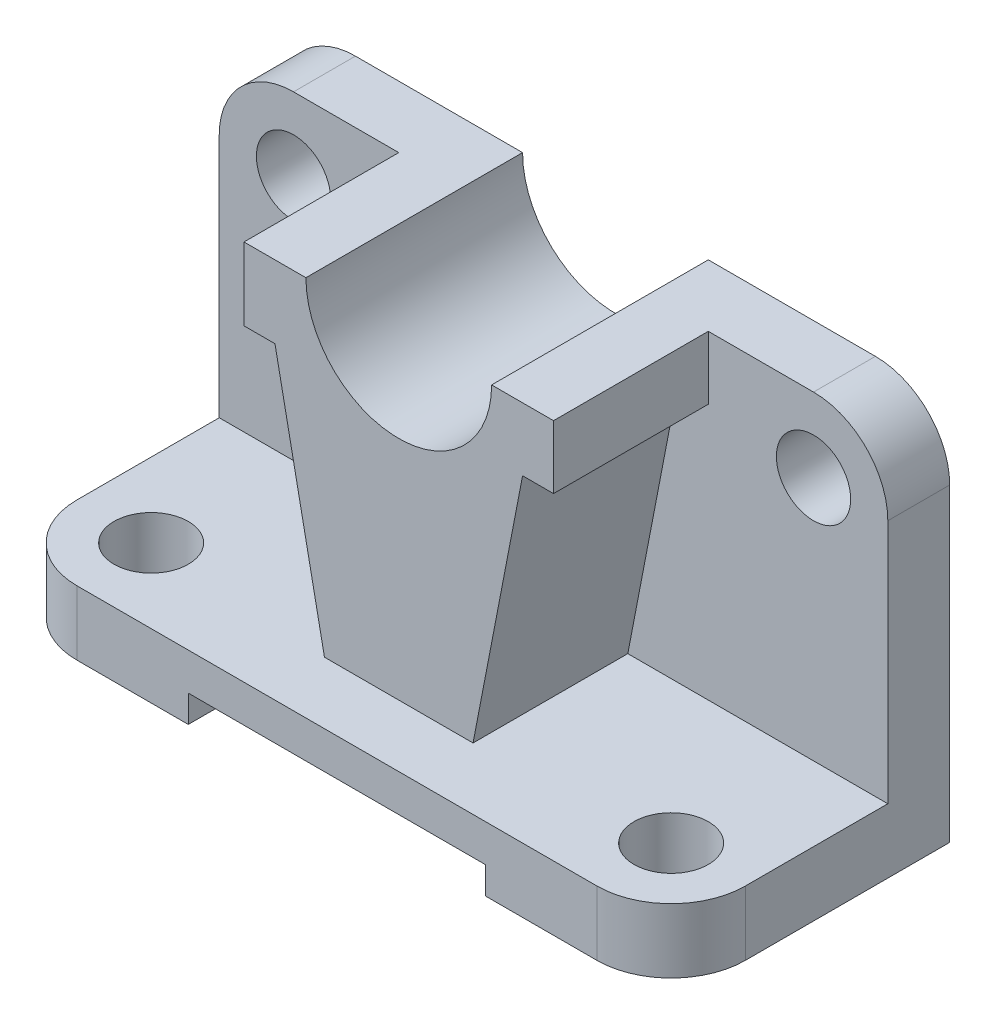
ISO-10303-21;
HEADER;
FILE_DESCRIPTION(('STEP AP214'),'2;1');
FILE_NAME('part.step','',(''),(''),'','','');
FILE_SCHEMA(('AUTOMOTIVE_DESIGN { 1 0 10303 214 1 1 1 1 }'));
ENDSEC;
DATA;
#1=APPLICATION_CONTEXT('core data for automotive mechanical design processes');
#2=APPLICATION_PROTOCOL_DEFINITION('international standard','automotive_design',2000,#1);
#3=PRODUCT_CONTEXT('',#1,'mechanical');
#4=PRODUCT('Part','Part','',(#3));
#5=PRODUCT_RELATED_PRODUCT_CATEGORY('part','',(#4));
#6=PRODUCT_DEFINITION_FORMATION('','',#4);
#7=PRODUCT_DEFINITION_CONTEXT('part definition',#1,'design');
#8=PRODUCT_DEFINITION('design','',#6,#7);
#9=PRODUCT_DEFINITION_SHAPE('','',#8);
#10=(LENGTH_UNIT() NAMED_UNIT(*) SI_UNIT(.MILLI.,.METRE.));
#11=(NAMED_UNIT(*) PLANE_ANGLE_UNIT() SI_UNIT($,.RADIAN.));
#12=(NAMED_UNIT(*) SI_UNIT($,.STERADIAN.) SOLID_ANGLE_UNIT());
#13=UNCERTAINTY_MEASURE_WITH_UNIT(LENGTH_MEASURE(1.E-05),#10,'distance_accuracy_value','');
#14=(GEOMETRIC_REPRESENTATION_CONTEXT(3) GLOBAL_UNCERTAINTY_ASSIGNED_CONTEXT((#13)) GLOBAL_UNIT_ASSIGNED_CONTEXT((#10,
#11,#12)) REPRESENTATION_CONTEXT('',''));
#15=CARTESIAN_POINT('',(0.,0.,0.));
#16=DIRECTION('',(0.,0.,1.));
#17=DIRECTION('',(1.,0.,0.));
#18=AXIS2_PLACEMENT_3D('',#15,#16,#17);
#19=CARTESIAN_POINT('',(0.,10.4081632653061,45.));
#20=DIRECTION('',(0.,1.,0.));
#21=DIRECTION('',(0.,0.,1.));
#22=AXIS2_PLACEMENT_3D('',#19,#20,#21);
#23=PLANE('',#22);
#24=CARTESIAN_POINT('',(12.,10.4081632653061,33.));
#25=DIRECTION('',(0.,1.,0.));
#26=DIRECTION('',(0.,0.,1.));
#27=AXIS2_PLACEMENT_3D('',#24,#25,#26);
#28=CIRCLE('',#27,6.);
#29=CARTESIAN_POINT('',(12.,10.4081632653061,39.));
#30=VERTEX_POINT('',#29);
#31=EDGE_CURVE('E397',#30,#30,#28,.T.);
#32=ORIENTED_EDGE('',*,*,#31,.F.);
#33=EDGE_LOOP('',(#32));
#34=FACE_BOUND('',#33,.T.);
#35=CARTESIAN_POINT('',(96.,10.4081632653061,33.));
#36=DIRECTION('',(0.,1.,0.));
#37=DIRECTION('',(0.,0.,1.));
#38=AXIS2_PLACEMENT_3D('',#35,#36,#37);
#39=CIRCLE('',#38,6.);
#40=CARTESIAN_POINT('',(96.,10.4081632653061,39.));
#41=VERTEX_POINT('',#40);
#42=EDGE_CURVE('E394',#41,#41,#39,.T.);
#43=ORIENTED_EDGE('',*,*,#42,.F.);
#44=EDGE_LOOP('',(#43));
#45=FACE_BOUND('',#44,.T.);
#46=DIRECTION('',(1.,0.,0.));
#47=VECTOR('',#46,1.);
#48=CARTESIAN_POINT('',(0.,10.4081632653061,45.));
#49=LINE('',#48,#47);
#50=CARTESIAN_POINT('',(12.,10.4081632653061,45.));
#51=VERTEX_POINT('',#50);
#52=CARTESIAN_POINT('',(96.,10.4081632653061,45.));
#53=VERTEX_POINT('',#52);
#54=EDGE_CURVE('E281',#51,#53,#49,.T.);
#55=ORIENTED_EDGE('',*,*,#54,.T.);
#56=CARTESIAN_POINT('',(96.,10.4081632653061,33.));
#57=DIRECTION('',(0.,1.,0.));
#58=DIRECTION('',(0.,0.,1.));
#59=AXIS2_PLACEMENT_3D('',#56,#57,#58);
#60=CIRCLE('',#59,12.);
#61=CARTESIAN_POINT('',(108.,10.4081632653061,33.));
#62=VERTEX_POINT('',#61);
#63=EDGE_CURVE('E347',#53,#62,#60,.T.);
#64=ORIENTED_EDGE('',*,*,#63,.T.);
#65=DIRECTION('',(0.,0.,-1.));
#66=VECTOR('',#65,1.);
#67=CARTESIAN_POINT('',(108.,10.4081632653061,45.));
#68=LINE('',#67,#66);
#69=CARTESIAN_POINT('',(108.,10.4081632653061,10.));
#70=VERTEX_POINT('',#69);
#71=EDGE_CURVE('E314',#62,#70,#68,.T.);
#72=ORIENTED_EDGE('',*,*,#71,.T.);
#73=DIRECTION('',(1.,0.,0.));
#74=VECTOR('',#73,1.);
#75=CARTESIAN_POINT('',(0.,10.4081632653061,10.));
#76=LINE('',#75,#74);
#77=CARTESIAN_POINT('',(66.,10.4081632653061,10.));
#78=VERTEX_POINT('',#77);
#79=EDGE_CURVE('E219',#78,#70,#76,.T.);
#80=ORIENTED_EDGE('',*,*,#79,.F.);
#81=DIRECTION('',(0.,0.,-1.));
#82=VECTOR('',#81,1.);
#83=CARTESIAN_POINT('',(66.,10.4081632653061,35.));
#84=LINE('',#83,#82);
#85=CARTESIAN_POINT('',(66.,10.4081632653061,35.));
#86=VERTEX_POINT('',#85);
#87=EDGE_CURVE('E210',#86,#78,#84,.T.);
#88=ORIENTED_EDGE('',*,*,#87,.F.);
#89=DIRECTION('',(1.,0.,0.));
#90=VECTOR('',#89,1.);
#91=CARTESIAN_POINT('',(0.,10.4081632653061,35.));
#92=LINE('',#91,#90);
#93=CARTESIAN_POINT('',(42.,10.4081632653061,35.));
#94=VERTEX_POINT('',#93);
#95=EDGE_CURVE('E194',#94,#86,#92,.T.);
#96=ORIENTED_EDGE('',*,*,#95,.F.);
#97=DIRECTION('',(0.,0.,-1.));
#98=VECTOR('',#97,1.);
#99=CARTESIAN_POINT('',(42.,10.4081632653061,35.));
#100=LINE('',#99,#98);
#101=CARTESIAN_POINT('',(42.,10.4081632653061,10.));
#102=VERTEX_POINT('',#101);
#103=EDGE_CURVE('E361',#94,#102,#100,.T.);
#104=ORIENTED_EDGE('',*,*,#103,.T.);
#105=DIRECTION('',(1.,0.,0.));
#106=VECTOR('',#105,1.);
#107=CARTESIAN_POINT('',(0.,10.4081632653061,10.));
#108=LINE('',#107,#106);
#109=CARTESIAN_POINT('',(0.,10.4081632653061,10.));
#110=VERTEX_POINT('',#109);
#111=EDGE_CURVE('E262',#110,#102,#108,.T.);
#112=ORIENTED_EDGE('',*,*,#111,.F.);
#113=DIRECTION('',(0.,0.,-1.));
#114=VECTOR('',#113,1.);
#115=CARTESIAN_POINT('',(0.,10.4081632653061,45.));
#116=LINE('',#115,#114);
#117=CARTESIAN_POINT('',(0.,10.4081632653061,33.));
#118=VERTEX_POINT('',#117);
#119=EDGE_CURVE('E312',#118,#110,#116,.T.);
#120=ORIENTED_EDGE('',*,*,#119,.F.);
#121=CARTESIAN_POINT('',(12.,10.4081632653061,33.));
#122=DIRECTION('',(0.,1.,0.));
#123=DIRECTION('',(0.,0.,1.));
#124=AXIS2_PLACEMENT_3D('',#121,#122,#123);
#125=CIRCLE('',#124,12.);
#126=EDGE_CURVE('E345',#118,#51,#125,.T.);
#127=ORIENTED_EDGE('',*,*,#126,.T.);
#128=EDGE_LOOP('',(#55,#64,#72,#80,#88,#96,#104,#112,#120,#127));
#129=FACE_BOUND('',#128,.T.);
#130=ADVANCED_FACE('F33',(#34,#45,#129),#23,.T.);
#131=CARTESIAN_POINT('',(0.,4.38775510204082,45.));
#132=DIRECTION('',(0.,1.,0.));
#133=DIRECTION('',(0.,0.,1.));
#134=AXIS2_PLACEMENT_3D('',#131,#132,#133);
#135=PLANE('',#134);
#136=DIRECTION('',(1.,0.,0.));
#137=VECTOR('',#136,1.);
#138=CARTESIAN_POINT('',(0.,4.38775510204082,0.));
#139=LINE('',#138,#137);
#140=CARTESIAN_POINT('',(30.0000000000001,4.38775510204082,0.));
#141=VERTEX_POINT('',#140);
#142=CARTESIAN_POINT('',(78.,4.38775510204082,0.));
#143=VERTEX_POINT('',#142);
#144=EDGE_CURVE('E268',#141,#143,#139,.T.);
#145=ORIENTED_EDGE('',*,*,#144,.T.);
#146=DIRECTION('',(0.,0.,-1.));
#147=VECTOR('',#146,1.);
#148=CARTESIAN_POINT('',(78.,4.38775510204082,45.));
#149=LINE('',#148,#147);
#150=CARTESIAN_POINT('',(78.,4.38775510204082,45.));
#151=VERTEX_POINT('',#150);
#152=EDGE_CURVE('E320',#151,#143,#149,.T.);
#153=ORIENTED_EDGE('',*,*,#152,.F.);
#154=DIRECTION('',(1.,0.,0.));
#155=VECTOR('',#154,1.);
#156=CARTESIAN_POINT('',(0.,4.38775510204082,45.));
#157=LINE('',#156,#155);
#158=CARTESIAN_POINT('',(30.0000000000001,4.38775510204082,45.));
#159=VERTEX_POINT('',#158);
#160=EDGE_CURVE('E272',#159,#151,#157,.T.);
#161=ORIENTED_EDGE('',*,*,#160,.F.);
#162=DIRECTION('',(0.,0.,-1.));
#163=VECTOR('',#162,1.);
#164=CARTESIAN_POINT('',(30.0000000000001,4.38775510204082,45.));
#165=LINE('',#164,#163);
#166=EDGE_CURVE('E287',#159,#141,#165,.T.);
#167=ORIENTED_EDGE('',*,*,#166,.T.);
#168=EDGE_LOOP('',(#145,#153,#161,#167));
#169=FACE_BOUND('',#168,.T.);
#170=ADVANCED_FACE('F449',(#169),#135,.F.);
#171=CARTESIAN_POINT('',(78.,0.,45.));
#172=DIRECTION('',(-1.,0.,0.));
#173=DIRECTION('',(0.,0.,1.));
#174=AXIS2_PLACEMENT_3D('',#171,#172,#173);
#175=PLANE('',#174);
#176=DIRECTION('',(0.,1.,0.));
#177=VECTOR('',#176,1.);
#178=CARTESIAN_POINT('',(78.,0.,0.));
#179=LINE('',#178,#177);
#180=CARTESIAN_POINT('',(78.,0.,0.));
#181=VERTEX_POINT('',#180);
#182=EDGE_CURVE('E290',#181,#143,#179,.T.);
#183=ORIENTED_EDGE('',*,*,#182,.F.);
#184=DIRECTION('',(0.,0.,-1.));
#185=VECTOR('',#184,1.);
#186=CARTESIAN_POINT('',(78.,0.,45.));
#187=LINE('',#186,#185);
#188=CARTESIAN_POINT('',(78.,0.,45.));
#189=VERTEX_POINT('',#188);
#190=EDGE_CURVE('E318',#189,#181,#187,.T.);
#191=ORIENTED_EDGE('',*,*,#190,.F.);
#192=DIRECTION('',(0.,1.,0.));
#193=VECTOR('',#192,1.);
#194=CARTESIAN_POINT('',(78.,0.,45.));
#195=LINE('',#194,#193);
#196=EDGE_CURVE('E274',#189,#151,#195,.T.);
#197=ORIENTED_EDGE('',*,*,#196,.T.);
#198=ORIENTED_EDGE('',*,*,#152,.T.);
#199=EDGE_LOOP('',(#183,#191,#197,#198));
#200=FACE_BOUND('',#199,.T.);
#201=ADVANCED_FACE('F444',(#200),#175,.T.);
#202=CARTESIAN_POINT('',(0.,0.,45.));
#203=DIRECTION('',(0.,1.,0.));
#204=DIRECTION('',(0.,0.,1.));
#205=AXIS2_PLACEMENT_3D('',#202,#203,#204);
#206=PLANE('',#205);
#207=CARTESIAN_POINT('',(96.,0.,33.));
#208=DIRECTION('',(0.,1.,0.));
#209=DIRECTION('',(0.,0.,1.));
#210=AXIS2_PLACEMENT_3D('',#207,#208,#209);
#211=CIRCLE('',#210,6.);
#212=CARTESIAN_POINT('',(96.,0.,39.));
#213=VERTEX_POINT('',#212);
#214=EDGE_CURVE('E551',#213,#213,#211,.T.);
#215=ORIENTED_EDGE('',*,*,#214,.T.);
#216=EDGE_LOOP('',(#215));
#217=FACE_BOUND('',#216,.T.);
#218=DIRECTION('',(0.,0.,-1.));
#219=VECTOR('',#218,1.);
#220=CARTESIAN_POINT('',(108.,0.,45.));
#221=LINE('',#220,#219);
#222=CARTESIAN_POINT('',(108.,0.,33.));
#223=VERTEX_POINT('',#222);
#224=CARTESIAN_POINT('',(108.,0.,0.));
#225=VERTEX_POINT('',#224);
#226=EDGE_CURVE('E316',#223,#225,#221,.T.);
#227=ORIENTED_EDGE('',*,*,#226,.F.);
#228=CARTESIAN_POINT('',(96.,0.,33.));
#229=DIRECTION('',(0.,1.,0.));
#230=DIRECTION('',(0.,0.,1.));
#231=AXIS2_PLACEMENT_3D('',#228,#229,#230);
#232=CIRCLE('',#231,12.);
#233=CARTESIAN_POINT('',(96.,0.,45.));
#234=VERTEX_POINT('',#233);
#235=EDGE_CURVE('E350',#223,#234,#232,.F.);
#236=ORIENTED_EDGE('',*,*,#235,.T.);
#237=DIRECTION('',(1.,0.,0.));
#238=VECTOR('',#237,1.);
#239=CARTESIAN_POINT('',(0.,0.,45.));
#240=LINE('',#239,#238);
#241=EDGE_CURVE('E278',#189,#234,#240,.T.);
#242=ORIENTED_EDGE('',*,*,#241,.F.);
#243=ORIENTED_EDGE('',*,*,#190,.T.);
#244=DIRECTION('',(1.,0.,0.));
#245=VECTOR('',#244,1.);
#246=CARTESIAN_POINT('',(0.,0.,0.));
#247=LINE('',#246,#245);
#248=EDGE_CURVE('E293',#181,#225,#247,.T.);
#249=ORIENTED_EDGE('',*,*,#248,.T.);
#250=EDGE_LOOP('',(#227,#236,#242,#243,#249));
#251=FACE_BOUND('',#250,.T.);
#252=ADVANCED_FACE('F439',(#217,#251),#206,.F.);
#253=CARTESIAN_POINT('',(108.,0.,45.));
#254=DIRECTION('',(-1.,0.,0.));
#255=DIRECTION('',(0.,0.,1.));
#256=AXIS2_PLACEMENT_3D('',#253,#254,#255);
#257=PLANE('',#256);
#258=ORIENTED_EDGE('',*,*,#71,.F.);
#259=DIRECTION('',(0.,1.,0.));
#260=VECTOR('',#259,1.);
#261=CARTESIAN_POINT('',(108.,0.,33.));
#262=LINE('',#261,#260);
#263=EDGE_CURVE('E54',#62,#223,#262,.F.);
#264=ORIENTED_EDGE('',*,*,#263,.T.);
#265=ORIENTED_EDGE('',*,*,#226,.T.);
#266=DIRECTION('',(0.,1.,0.));
#267=VECTOR('',#266,1.);
#268=CARTESIAN_POINT('',(108.,0.,0.));
#269=LINE('',#268,#267);
#270=CARTESIAN_POINT('',(108.,50.,0.));
#271=VERTEX_POINT('',#270);
#272=EDGE_CURVE('E296',#225,#271,#269,.T.);
#273=ORIENTED_EDGE('',*,*,#272,.T.);
#274=DIRECTION('',(0.,0.,-1.));
#275=VECTOR('',#274,1.);
#276=CARTESIAN_POINT('',(108.,50.,10.));
#277=LINE('',#276,#275);
#278=CARTESIAN_POINT('',(108.,50.,10.));
#279=VERTEX_POINT('',#278);
#280=EDGE_CURVE('E336',#271,#279,#277,.F.);
#281=ORIENTED_EDGE('',*,*,#280,.T.);
#282=DIRECTION('',(0.,1.,0.));
#283=VECTOR('',#282,1.);
#284=CARTESIAN_POINT('',(108.,0.,10.));
#285=LINE('',#284,#283);
#286=EDGE_CURVE('E238',#70,#279,#285,.T.);
#287=ORIENTED_EDGE('',*,*,#286,.F.);
#288=EDGE_LOOP('',(#258,#264,#265,#273,#281,#287));
#289=FACE_BOUND('',#288,.T.);
#290=ADVANCED_FACE('F435',(#289),#257,.F.);
#291=CARTESIAN_POINT('',(0.,0.,45.));
#292=DIRECTION('',(-1.,0.,0.));
#293=DIRECTION('',(0.,0.,1.));
#294=AXIS2_PLACEMENT_3D('',#291,#292,#293);
#295=PLANE('',#294);
#296=DIRECTION('',(0.,0.,-1.));
#297=VECTOR('',#296,1.);
#298=CARTESIAN_POINT('',(0.,0.,45.));
#299=LINE('',#298,#297);
#300=CARTESIAN_POINT('',(0.,0.,33.));
#301=VERTEX_POINT('',#300);
#302=CARTESIAN_POINT('',(0.,0.,0.));
#303=VERTEX_POINT('',#302);
#304=EDGE_CURVE('E310',#301,#303,#299,.T.);
#305=ORIENTED_EDGE('',*,*,#304,.F.);
#306=DIRECTION('',(0.,1.,0.));
#307=VECTOR('',#306,1.);
#308=CARTESIAN_POINT('',(0.,0.,33.));
#309=LINE('',#308,#307);
#310=EDGE_CURVE('E41',#301,#118,#309,.T.);
#311=ORIENTED_EDGE('',*,*,#310,.T.);
#312=ORIENTED_EDGE('',*,*,#119,.T.);
#313=DIRECTION('',(0.,1.,0.));
#314=VECTOR('',#313,1.);
#315=CARTESIAN_POINT('',(0.,0.,10.));
#316=LINE('',#315,#314);
#317=CARTESIAN_POINT('',(0.,50.,10.));
#318=VERTEX_POINT('',#317);
#319=EDGE_CURVE('E259',#110,#318,#316,.T.);
#320=ORIENTED_EDGE('',*,*,#319,.T.);
#321=DIRECTION('',(0.,0.,-1.));
#322=VECTOR('',#321,1.);
#323=CARTESIAN_POINT('',(0.,50.,45.));
#324=LINE('',#323,#322);
#325=CARTESIAN_POINT('',(0.,50.,0.));
#326=VERTEX_POINT('',#325);
#327=EDGE_CURVE('E322',#318,#326,#324,.T.);
#328=ORIENTED_EDGE('',*,*,#327,.T.);
#329=DIRECTION('',(0.,1.,0.));
#330=VECTOR('',#329,1.);
#331=CARTESIAN_POINT('',(0.,0.,0.));
#332=LINE('',#331,#330);
#333=EDGE_CURVE('E299',#303,#326,#332,.T.);
#334=ORIENTED_EDGE('',*,*,#333,.F.);
#335=EDGE_LOOP('',(#305,#311,#312,#320,#328,#334));
#336=FACE_BOUND('',#335,.T.);
#337=ADVANCED_FACE('F355',(#336),#295,.T.);
#338=CARTESIAN_POINT('',(0.,0.,45.));
#339=DIRECTION('',(0.,1.,0.));
#340=DIRECTION('',(0.,0.,1.));
#341=AXIS2_PLACEMENT_3D('',#338,#339,#340);
#342=PLANE('',#341);
#343=CARTESIAN_POINT('',(12.,0.,33.));
#344=DIRECTION('',(0.,1.,0.));
#345=DIRECTION('',(0.,0.,1.));
#346=AXIS2_PLACEMENT_3D('',#343,#344,#345);
#347=CIRCLE('',#346,6.);
#348=CARTESIAN_POINT('',(12.,0.,39.));
#349=VERTEX_POINT('',#348);
#350=EDGE_CURVE('E549',#349,#349,#347,.T.);
#351=ORIENTED_EDGE('',*,*,#350,.T.);
#352=EDGE_LOOP('',(#351));
#353=FACE_BOUND('',#352,.T.);
#354=DIRECTION('',(1.,0.,0.));
#355=VECTOR('',#354,1.);
#356=CARTESIAN_POINT('',(0.,0.,45.));
#357=LINE('',#356,#355);
#358=CARTESIAN_POINT('',(12.,0.,45.));
#359=VERTEX_POINT('',#358);
#360=CARTESIAN_POINT('',(30.0000000000001,0.,45.));
#361=VERTEX_POINT('',#360);
#362=EDGE_CURVE('E283',#359,#361,#357,.T.);
#363=ORIENTED_EDGE('',*,*,#362,.F.);
#364=CARTESIAN_POINT('',(12.,0.,33.));
#365=DIRECTION('',(0.,1.,0.));
#366=DIRECTION('',(0.,0.,1.));
#367=AXIS2_PLACEMENT_3D('',#364,#365,#366);
#368=CIRCLE('',#367,12.);
#369=EDGE_CURVE('E11',#359,#301,#368,.F.);
#370=ORIENTED_EDGE('',*,*,#369,.T.);
#371=ORIENTED_EDGE('',*,*,#304,.T.);
#372=DIRECTION('',(1.,0.,0.));
#373=VECTOR('',#372,1.);
#374=CARTESIAN_POINT('',(0.,0.,0.));
#375=LINE('',#374,#373);
#376=CARTESIAN_POINT('',(30.0000000000001,0.,0.));
#377=VERTEX_POINT('',#376);
#378=EDGE_CURVE('E302',#303,#377,#375,.T.);
#379=ORIENTED_EDGE('',*,*,#378,.T.);
#380=DIRECTION('',(0.,0.,-1.));
#381=VECTOR('',#380,1.);
#382=CARTESIAN_POINT('',(30.0000000000001,0.,45.));
#383=LINE('',#382,#381);
#384=EDGE_CURVE('E307',#361,#377,#383,.T.);
#385=ORIENTED_EDGE('',*,*,#384,.F.);
#386=EDGE_LOOP('',(#363,#370,#371,#379,#385));
#387=FACE_BOUND('',#386,.T.);
#388=ADVANCED_FACE('F456',(#353,#387),#342,.F.);
#389=CARTESIAN_POINT('',(30.0000000000001,0.,45.));
#390=DIRECTION('',(-1.,0.,0.));
#391=DIRECTION('',(0.,0.,1.));
#392=AXIS2_PLACEMENT_3D('',#389,#390,#391);
#393=PLANE('',#392);
#394=DIRECTION('',(0.,1.,0.));
#395=VECTOR('',#394,1.);
#396=CARTESIAN_POINT('',(30.0000000000001,0.,0.));
#397=LINE('',#396,#395);
#398=EDGE_CURVE('E275',#377,#141,#397,.T.);
#399=ORIENTED_EDGE('',*,*,#398,.T.);
#400=ORIENTED_EDGE('',*,*,#166,.F.);
#401=DIRECTION('',(0.,1.,0.));
#402=VECTOR('',#401,1.);
#403=CARTESIAN_POINT('',(30.0000000000001,0.,45.));
#404=LINE('',#403,#402);
#405=EDGE_CURVE('E285',#361,#159,#404,.T.);
#406=ORIENTED_EDGE('',*,*,#405,.F.);
#407=ORIENTED_EDGE('',*,*,#384,.T.);
#408=EDGE_LOOP('',(#399,#400,#406,#407));
#409=FACE_BOUND('',#408,.T.);
#410=ADVANCED_FACE('F453',(#409),#393,.F.);
#411=CARTESIAN_POINT('',(0.,0.,45.));
#412=DIRECTION('',(0.,0.,1.));
#413=DIRECTION('',(1.,0.,0.));
#414=AXIS2_PLACEMENT_3D('',#411,#412,#413);
#415=PLANE('',#414);
#416=ORIENTED_EDGE('',*,*,#241,.T.);
#417=DIRECTION('',(0.,1.,0.));
#418=VECTOR('',#417,1.);
#419=CARTESIAN_POINT('',(96.,10.4081632653061,45.));
#420=LINE('',#419,#418);
#421=EDGE_CURVE('E342',#234,#53,#420,.T.);
#422=ORIENTED_EDGE('',*,*,#421,.T.);
#423=ORIENTED_EDGE('',*,*,#54,.F.);
#424=DIRECTION('',(0.,1.,0.));
#425=VECTOR('',#424,1.);
#426=CARTESIAN_POINT('',(12.,0.,45.));
#427=LINE('',#426,#425);
#428=EDGE_CURVE('E340',#51,#359,#427,.F.);
#429=ORIENTED_EDGE('',*,*,#428,.T.);
#430=ORIENTED_EDGE('',*,*,#362,.T.);
#431=ORIENTED_EDGE('',*,*,#405,.T.);
#432=ORIENTED_EDGE('',*,*,#160,.T.);
#433=ORIENTED_EDGE('',*,*,#196,.F.);
#434=EDGE_LOOP('',(#416,#422,#423,#429,#430,#431,#432,#433));
#435=FACE_BOUND('',#434,.T.);
#436=ADVANCED_FACE('F459',(#435),#415,.T.);
#437=CARTESIAN_POINT('',(0.,0.,0.));
#438=DIRECTION('',(0.,0.,1.));
#439=DIRECTION('',(1.,0.,0.));
#440=AXIS2_PLACEMENT_3D('',#437,#438,#439);
#441=PLANE('',#440);
#442=DIRECTION('',(1.,0.,0.));
#443=VECTOR('',#442,1.);
#444=CARTESIAN_POINT('',(0.,62.,0.));
#445=LINE('',#444,#443);
#446=CARTESIAN_POINT('',(69.,62.,0.));
#447=VERTEX_POINT('',#446);
#448=CARTESIAN_POINT('',(96.,62.,0.));
#449=VERTEX_POINT('',#448);
#450=EDGE_CURVE('E223',#447,#449,#445,.T.);
#451=ORIENTED_EDGE('',*,*,#450,.T.);
#452=CARTESIAN_POINT('',(96.,50.,0.));
#453=DIRECTION('',(0.,0.,1.));
#454=DIRECTION('',(1.,0.,0.));
#455=AXIS2_PLACEMENT_3D('',#452,#453,#454);
#456=CIRCLE('',#455,12.);
#457=EDGE_CURVE('E334',#449,#271,#456,.F.);
#458=ORIENTED_EDGE('',*,*,#457,.T.);
#459=ORIENTED_EDGE('',*,*,#272,.F.);
#460=ORIENTED_EDGE('',*,*,#248,.F.);
#461=ORIENTED_EDGE('',*,*,#182,.T.);
#462=ORIENTED_EDGE('',*,*,#144,.F.);
#463=ORIENTED_EDGE('',*,*,#398,.F.);
#464=ORIENTED_EDGE('',*,*,#378,.F.);
#465=ORIENTED_EDGE('',*,*,#333,.T.);
#466=CARTESIAN_POINT('',(12.,50.,0.));
#467=DIRECTION('',(0.,0.,1.));
#468=DIRECTION('',(1.,0.,0.));
#469=AXIS2_PLACEMENT_3D('',#466,#467,#468);
#470=CIRCLE('',#469,12.);
#471=CARTESIAN_POINT('',(12.,62.,0.));
#472=VERTEX_POINT('',#471);
#473=EDGE_CURVE('E325',#326,#472,#470,.F.);
#474=ORIENTED_EDGE('',*,*,#473,.T.);
#475=DIRECTION('',(1.,0.,0.));
#476=VECTOR('',#475,1.);
#477=CARTESIAN_POINT('',(0.,62.,0.));
#478=LINE('',#477,#476);
#479=CARTESIAN_POINT('',(39.,62.,0.));
#480=VERTEX_POINT('',#479);
#481=EDGE_CURVE('E246',#472,#480,#478,.T.);
#482=ORIENTED_EDGE('',*,*,#481,.T.);
#483=CARTESIAN_POINT('',(54.,62.,0.));
#484=DIRECTION('',(0.,0.,1.));
#485=DIRECTION('',(1.,0.,0.));
#486=AXIS2_PLACEMENT_3D('',#483,#484,#485);
#487=CIRCLE('',#486,15.);
#488=EDGE_CURVE('E206',#447,#480,#487,.F.);
#489=ORIENTED_EDGE('',*,*,#488,.F.);
#490=EDGE_LOOP('',(#451,#458,#459,#460,#461,#462,#463,#464,#465,#474,#482,#489));
#491=FACE_BOUND('',#490,.T.);
#492=CARTESIAN_POINT('',(12.,50.,0.));
#493=DIRECTION('',(0.,0.,1.));
#494=DIRECTION('',(1.,0.,0.));
#495=AXIS2_PLACEMENT_3D('',#492,#493,#494);
#496=CIRCLE('',#495,6.);
#497=CARTESIAN_POINT('',(18.,50.,0.));
#498=VERTEX_POINT('',#497);
#499=EDGE_CURVE('E253',#498,#498,#496,.F.);
#500=ORIENTED_EDGE('',*,*,#499,.F.);
#501=EDGE_LOOP('',(#500));
#502=FACE_BOUND('',#501,.T.);
#503=CARTESIAN_POINT('',(96.,50.,0.));
#504=DIRECTION('',(0.,0.,1.));
#505=DIRECTION('',(1.,0.,0.));
#506=AXIS2_PLACEMENT_3D('',#503,#504,#505);
#507=CIRCLE('',#506,6.);
#508=CARTESIAN_POINT('',(102.,50.,0.));
#509=VERTEX_POINT('',#508);
#510=EDGE_CURVE('E220',#509,#509,#507,.T.);
#511=ORIENTED_EDGE('',*,*,#510,.T.);
#512=EDGE_LOOP('',(#511));
#513=FACE_BOUND('',#512,.T.);
#514=ADVANCED_FACE('F374',(#491,#502,#513),#441,.F.);
#515=CARTESIAN_POINT('',(0.,62.,10.));
#516=DIRECTION('',(0.,1.,0.));
#517=DIRECTION('',(0.,0.,1.));
#518=AXIS2_PLACEMENT_3D('',#515,#516,#517);
#519=PLANE('',#518);
#520=ORIENTED_EDGE('',*,*,#481,.F.);
#521=DIRECTION('',(0.,0.,-1.));
#522=VECTOR('',#521,1.);
#523=CARTESIAN_POINT('',(12.,62.,10.));
#524=LINE('',#523,#522);
#525=CARTESIAN_POINT('',(12.,62.,10.));
#526=VERTEX_POINT('',#525);
#527=EDGE_CURVE('E327',#472,#526,#524,.F.);
#528=ORIENTED_EDGE('',*,*,#527,.T.);
#529=DIRECTION('',(1.,0.,0.));
#530=VECTOR('',#529,1.);
#531=CARTESIAN_POINT('',(0.,62.,10.));
#532=LINE('',#531,#530);
#533=CARTESIAN_POINT('',(29.,62.,10.));
#534=VERTEX_POINT('',#533);
#535=EDGE_CURVE('E257',#526,#534,#532,.T.);
#536=ORIENTED_EDGE('',*,*,#535,.T.);
#537=DIRECTION('',(0.,0.,-1.));
#538=VECTOR('',#537,1.);
#539=CARTESIAN_POINT('',(29.,62.,35.));
#540=LINE('',#539,#538);
#541=CARTESIAN_POINT('',(29.,62.,35.));
#542=VERTEX_POINT('',#541);
#543=EDGE_CURVE('E390',#542,#534,#540,.T.);
#544=ORIENTED_EDGE('',*,*,#543,.F.);
#545=DIRECTION('',(1.,0.,0.));
#546=VECTOR('',#545,1.);
#547=CARTESIAN_POINT('',(0.,62.,35.));
#548=LINE('',#547,#546);
#549=CARTESIAN_POINT('',(39.,62.,35.));
#550=VERTEX_POINT('',#549);
#551=EDGE_CURVE('E386',#542,#550,#548,.T.);
#552=ORIENTED_EDGE('',*,*,#551,.T.);
#553=DIRECTION('',(0.,0.,-1.));
#554=VECTOR('',#553,1.);
#555=CARTESIAN_POINT('',(39.,62.,35.));
#556=LINE('',#555,#554);
#557=EDGE_CURVE('E383',#550,#480,#556,.T.);
#558=ORIENTED_EDGE('',*,*,#557,.T.);
#559=EDGE_LOOP('',(#520,#528,#536,#544,#552,#558));
#560=FACE_BOUND('',#559,.T.);
#561=ADVANCED_FACE('F380',(#560),#519,.T.);
#562=CARTESIAN_POINT('',(12.,50.,10.));
#563=DIRECTION('',(0.,0.,-1.));
#564=DIRECTION('',(-1.,0.,0.));
#565=AXIS2_PLACEMENT_3D('',#562,#563,#564);
#566=CYLINDRICAL_SURFACE('',#565,6.);
#567=CARTESIAN_POINT('',(12.,50.,10.));
#568=DIRECTION('',(0.,0.,1.));
#569=DIRECTION('',(1.,0.,0.));
#570=AXIS2_PLACEMENT_3D('',#567,#568,#569);
#571=CIRCLE('',#570,6.);
#572=CARTESIAN_POINT('',(18.,50.,10.));
#573=VERTEX_POINT('',#572);
#574=EDGE_CURVE('E265',#573,#573,#571,.F.);
#575=ORIENTED_EDGE('',*,*,#574,.F.);
#576=EDGE_LOOP('',(#575));
#577=FACE_BOUND('',#576,.T.);
#578=ORIENTED_EDGE('',*,*,#499,.T.);
#579=EDGE_LOOP('',(#578));
#580=FACE_BOUND('',#579,.T.);
#581=ADVANCED_FACE('F531',(#577,#580),#566,.F.);
#582=CARTESIAN_POINT('',(0.,0.,10.));
#583=DIRECTION('',(0.,0.,1.));
#584=DIRECTION('',(1.,0.,0.));
#585=AXIS2_PLACEMENT_3D('',#582,#583,#584);
#586=PLANE('',#585);
#587=ORIENTED_EDGE('',*,*,#535,.F.);
#588=CARTESIAN_POINT('',(12.,50.,10.));
#589=DIRECTION('',(0.,0.,1.));
#590=DIRECTION('',(1.,0.,0.));
#591=AXIS2_PLACEMENT_3D('',#588,#589,#590);
#592=CIRCLE('',#591,12.);
#593=EDGE_CURVE('E329',#526,#318,#592,.T.);
#594=ORIENTED_EDGE('',*,*,#593,.T.);
#595=ORIENTED_EDGE('',*,*,#319,.F.);
#596=ORIENTED_EDGE('',*,*,#111,.T.);
#597=DIRECTION('',(0.196791884871607,-0.980445283556752,0.));
#598=VECTOR('',#597,1.);
#599=CARTESIAN_POINT('',(42.3816533442477,8.50671178235797,10.));
#600=LINE('',#599,#598);
#601=CARTESIAN_POINT('',(34.,50.2653061224489,10.));
#602=VERTEX_POINT('',#601);
#603=EDGE_CURVE('E250',#602,#102,#600,.T.);
#604=ORIENTED_EDGE('',*,*,#603,.F.);
#605=DIRECTION('',(1.,0.,0.));
#606=VECTOR('',#605,1.);
#607=CARTESIAN_POINT('',(0.,50.265306122449,10.));
#608=LINE('',#607,#606);
#609=CARTESIAN_POINT('',(29.,50.265306122449,10.));
#610=VERTEX_POINT('',#609);
#611=EDGE_CURVE('E252',#610,#602,#608,.T.);
#612=ORIENTED_EDGE('',*,*,#611,.F.);
#613=DIRECTION('',(0.,-1.,0.));
#614=VECTOR('',#613,1.);
#615=CARTESIAN_POINT('',(29.,0.,10.));
#616=LINE('',#615,#614);
#617=EDGE_CURVE('E255',#534,#610,#616,.T.);
#618=ORIENTED_EDGE('',*,*,#617,.F.);
#619=EDGE_LOOP('',(#587,#594,#595,#596,#604,#612,#618));
#620=FACE_BOUND('',#619,.T.);
#621=ORIENTED_EDGE('',*,*,#574,.T.);
#622=EDGE_LOOP('',(#621));
#623=FACE_BOUND('',#622,.T.);
#624=ADVANCED_FACE('F365',(#620,#623),#586,.T.);
#625=CARTESIAN_POINT('',(0.,62.,10.));
#626=DIRECTION('',(0.,1.,0.));
#627=DIRECTION('',(0.,0.,1.));
#628=AXIS2_PLACEMENT_3D('',#625,#626,#627);
#629=PLANE('',#628);
#630=DIRECTION('',(1.,0.,0.));
#631=VECTOR('',#630,1.);
#632=CARTESIAN_POINT('',(0.,62.,10.));
#633=LINE('',#632,#631);
#634=CARTESIAN_POINT('',(79.,62.,10.));
#635=VERTEX_POINT('',#634);
#636=CARTESIAN_POINT('',(96.,62.,10.));
#637=VERTEX_POINT('',#636);
#638=EDGE_CURVE('E241',#635,#637,#633,.T.);
#639=ORIENTED_EDGE('',*,*,#638,.T.);
#640=DIRECTION('',(0.,0.,-1.));
#641=VECTOR('',#640,1.);
#642=CARTESIAN_POINT('',(96.,62.,0.));
#643=LINE('',#642,#641);
#644=EDGE_CURVE('E331',#637,#449,#643,.T.);
#645=ORIENTED_EDGE('',*,*,#644,.T.);
#646=ORIENTED_EDGE('',*,*,#450,.F.);
#647=DIRECTION('',(0.,0.,-1.));
#648=VECTOR('',#647,1.);
#649=CARTESIAN_POINT('',(69.,62.,35.));
#650=LINE('',#649,#648);
#651=CARTESIAN_POINT('',(69.,62.,35.));
#652=VERTEX_POINT('',#651);
#653=EDGE_CURVE('E389',#652,#447,#650,.T.);
#654=ORIENTED_EDGE('',*,*,#653,.F.);
#655=DIRECTION('',(1.,0.,0.));
#656=VECTOR('',#655,1.);
#657=CARTESIAN_POINT('',(0.,62.,35.));
#658=LINE('',#657,#656);
#659=CARTESIAN_POINT('',(79.,62.,35.));
#660=VERTEX_POINT('',#659);
#661=EDGE_CURVE('E560',#652,#660,#658,.T.);
#662=ORIENTED_EDGE('',*,*,#661,.T.);
#663=DIRECTION('',(0.,0.,-1.));
#664=VECTOR('',#663,1.);
#665=CARTESIAN_POINT('',(79.,62.,35.));
#666=LINE('',#665,#664);
#667=EDGE_CURVE('E412',#660,#635,#666,.T.);
#668=ORIENTED_EDGE('',*,*,#667,.T.);
#669=EDGE_LOOP('',(#639,#645,#646,#654,#662,#668));
#670=FACE_BOUND('',#669,.T.);
#671=ADVANCED_FACE('F428',(#670),#629,.T.);
#672=CARTESIAN_POINT('',(96.,50.,10.));
#673=DIRECTION('',(0.,0.,-1.));
#674=DIRECTION('',(-1.,0.,0.));
#675=AXIS2_PLACEMENT_3D('',#672,#673,#674);
#676=CYLINDRICAL_SURFACE('',#675,6.);
#677=CARTESIAN_POINT('',(96.,50.,10.));
#678=DIRECTION('',(0.,0.,1.));
#679=DIRECTION('',(1.,0.,0.));
#680=AXIS2_PLACEMENT_3D('',#677,#678,#679);
#681=CIRCLE('',#680,6.);
#682=CARTESIAN_POINT('',(102.,50.,10.));
#683=VERTEX_POINT('',#682);
#684=EDGE_CURVE('E229',#683,#683,#681,.T.);
#685=ORIENTED_EDGE('',*,*,#684,.T.);
#686=EDGE_LOOP('',(#685));
#687=FACE_BOUND('',#686,.T.);
#688=ORIENTED_EDGE('',*,*,#510,.F.);
#689=EDGE_LOOP('',(#688));
#690=FACE_BOUND('',#689,.T.);
#691=ADVANCED_FACE('F522',(#687,#690),#676,.F.);
#692=CARTESIAN_POINT('',(0.,0.,10.));
#693=DIRECTION('',(0.,0.,1.));
#694=DIRECTION('',(1.,0.,0.));
#695=AXIS2_PLACEMENT_3D('',#692,#693,#694);
#696=PLANE('',#695);
#697=ORIENTED_EDGE('',*,*,#684,.F.);
#698=EDGE_LOOP('',(#697));
#699=FACE_BOUND('',#698,.T.);
#700=ORIENTED_EDGE('',*,*,#286,.T.);
#701=CARTESIAN_POINT('',(96.,50.,10.));
#702=DIRECTION('',(0.,0.,1.));
#703=DIRECTION('',(1.,0.,0.));
#704=AXIS2_PLACEMENT_3D('',#701,#702,#703);
#705=CIRCLE('',#704,12.);
#706=EDGE_CURVE('E338',#279,#637,#705,.T.);
#707=ORIENTED_EDGE('',*,*,#706,.T.);
#708=ORIENTED_EDGE('',*,*,#638,.F.);
#709=DIRECTION('',(0.,-1.,0.));
#710=VECTOR('',#709,1.);
#711=CARTESIAN_POINT('',(79.0000000000001,1.07441833208099E-13,10.));
#712=LINE('',#711,#710);
#713=CARTESIAN_POINT('',(79.,51.7959183673469,10.));
#714=VERTEX_POINT('',#713);
#715=EDGE_CURVE('E244',#635,#714,#712,.T.);
#716=ORIENTED_EDGE('',*,*,#715,.T.);
#717=DIRECTION('',(-1.,0.,0.));
#718=VECTOR('',#717,1.);
#719=CARTESIAN_POINT('',(0.,51.795918367347,10.));
#720=LINE('',#719,#718);
#721=CARTESIAN_POINT('',(74.,51.7959183673469,10.));
#722=VERTEX_POINT('',#721);
#723=EDGE_CURVE('E232',#714,#722,#720,.T.);
#724=ORIENTED_EDGE('',*,*,#723,.T.);
#725=DIRECTION('',(-0.189781047165808,-0.981826437888413,0.));
#726=VECTOR('',#725,1.);
#727=CARTESIAN_POINT('',(61.6835137800812,-11.9230460561104,10.));
#728=LINE('',#727,#726);
#729=EDGE_CURVE('E235',#722,#78,#728,.T.);
#730=ORIENTED_EDGE('',*,*,#729,.T.);
#731=ORIENTED_EDGE('',*,*,#79,.T.);
#732=EDGE_LOOP('',(#700,#707,#708,#716,#724,#730,#731));
#733=FACE_BOUND('',#732,.T.);
#734=ADVANCED_FACE('F424',(#699,#733),#696,.T.);
#735=CARTESIAN_POINT('',(61.6835137800812,-11.9230460561104,35.));
#736=DIRECTION('',(0.981826437888413,-0.189781047165808,0.));
#737=DIRECTION('',(0.189781047165808,0.981826437888413,0.));
#738=AXIS2_PLACEMENT_3D('',#735,#736,#737);
#739=PLANE('',#738);
#740=ORIENTED_EDGE('',*,*,#87,.T.);
#741=ORIENTED_EDGE('',*,*,#729,.F.);
#742=DIRECTION('',(0.,0.,-1.));
#743=VECTOR('',#742,1.);
#744=CARTESIAN_POINT('',(74.,51.7959183673469,35.));
#745=LINE('',#744,#743);
#746=CARTESIAN_POINT('',(74.,51.7959183673469,35.));
#747=VERTEX_POINT('',#746);
#748=EDGE_CURVE('E213',#747,#722,#745,.T.);
#749=ORIENTED_EDGE('',*,*,#748,.F.);
#750=DIRECTION('',(-0.189781047165808,-0.981826437888413,0.));
#751=VECTOR('',#750,1.);
#752=CARTESIAN_POINT('',(61.6835137800812,-11.9230460561104,35.));
#753=LINE('',#752,#751);
#754=EDGE_CURVE('E198',#747,#86,#753,.T.);
#755=ORIENTED_EDGE('',*,*,#754,.T.);
#756=EDGE_LOOP('',(#740,#741,#749,#755));
#757=FACE_BOUND('',#756,.T.);
#758=ADVANCED_FACE('F209',(#757),#739,.T.);
#759=CARTESIAN_POINT('',(0.,51.795918367347,35.));
#760=DIRECTION('',(0.,-1.,0.));
#761=DIRECTION('',(1.,0.,0.));
#762=AXIS2_PLACEMENT_3D('',#759,#760,#761);
#763=PLANE('',#762);
#764=ORIENTED_EDGE('',*,*,#748,.T.);
#765=ORIENTED_EDGE('',*,*,#723,.F.);
#766=DIRECTION('',(0.,0.,-1.));
#767=VECTOR('',#766,1.);
#768=CARTESIAN_POINT('',(79.,51.7959183673469,35.));
#769=LINE('',#768,#767);
#770=CARTESIAN_POINT('',(79.,51.7959183673469,35.));
#771=VERTEX_POINT('',#770);
#772=EDGE_CURVE('E225',#771,#714,#769,.T.);
#773=ORIENTED_EDGE('',*,*,#772,.F.);
#774=DIRECTION('',(-1.,0.,0.));
#775=VECTOR('',#774,1.);
#776=CARTESIAN_POINT('',(0.,51.795918367347,35.));
#777=LINE('',#776,#775);
#778=EDGE_CURVE('E214',#771,#747,#777,.T.);
#779=ORIENTED_EDGE('',*,*,#778,.T.);
#780=EDGE_LOOP('',(#764,#765,#773,#779));
#781=FACE_BOUND('',#780,.T.);
#782=ADVANCED_FACE('F421',(#781),#763,.T.);
#783=CARTESIAN_POINT('',(79.0000000000001,1.07441833208099E-13,35.));
#784=DIRECTION('',(1.,0.,0.));
#785=DIRECTION('',(0.,1.,0.));
#786=AXIS2_PLACEMENT_3D('',#783,#784,#785);
#787=PLANE('',#786);
#788=ORIENTED_EDGE('',*,*,#772,.T.);
#789=ORIENTED_EDGE('',*,*,#715,.F.);
#790=ORIENTED_EDGE('',*,*,#667,.F.);
#791=DIRECTION('',(0.,-1.,0.));
#792=VECTOR('',#791,1.);
#793=CARTESIAN_POINT('',(79.0000000000001,1.07441833208099E-13,35.));
#794=LINE('',#793,#792);
#795=EDGE_CURVE('E419',#660,#771,#794,.T.);
#796=ORIENTED_EDGE('',*,*,#795,.T.);
#797=EDGE_LOOP('',(#788,#789,#790,#796));
#798=FACE_BOUND('',#797,.T.);
#799=ADVANCED_FACE('F417',(#798),#787,.T.);
#800=CARTESIAN_POINT('',(54.,62.,35.));
#801=DIRECTION('',(0.,0.,-1.));
#802=DIRECTION('',(-1.,0.,0.));
#803=AXIS2_PLACEMENT_3D('',#800,#801,#802);
#804=CYLINDRICAL_SURFACE('',#803,15.);
#805=ORIENTED_EDGE('',*,*,#488,.T.);
#806=ORIENTED_EDGE('',*,*,#557,.F.);
#807=CARTESIAN_POINT('',(54.,62.,35.));
#808=DIRECTION('',(0.,0.,1.));
#809=DIRECTION('',(1.,0.,0.));
#810=AXIS2_PLACEMENT_3D('',#807,#808,#809);
#811=CIRCLE('',#810,15.);
#812=EDGE_CURVE('E562',#652,#550,#811,.F.);
#813=ORIENTED_EDGE('',*,*,#812,.F.);
#814=ORIENTED_EDGE('',*,*,#653,.T.);
#815=EDGE_LOOP('',(#805,#806,#813,#814));
#816=FACE_BOUND('',#815,.T.);
#817=ADVANCED_FACE('F393',(#816),#804,.F.);
#818=CARTESIAN_POINT('',(29.,0.,35.));
#819=DIRECTION('',(1.,0.,0.));
#820=DIRECTION('',(0.,0.,-1.));
#821=AXIS2_PLACEMENT_3D('',#818,#819,#820);
#822=PLANE('',#821);
#823=ORIENTED_EDGE('',*,*,#617,.T.);
#824=DIRECTION('',(0.,0.,-1.));
#825=VECTOR('',#824,1.);
#826=CARTESIAN_POINT('',(29.,50.265306122449,35.));
#827=LINE('',#826,#825);
#828=CARTESIAN_POINT('',(29.,50.265306122449,35.));
#829=VERTEX_POINT('',#828);
#830=EDGE_CURVE('E406',#829,#610,#827,.T.);
#831=ORIENTED_EDGE('',*,*,#830,.F.);
#832=DIRECTION('',(0.,-1.,0.));
#833=VECTOR('',#832,1.);
#834=CARTESIAN_POINT('',(29.,0.,35.));
#835=LINE('',#834,#833);
#836=EDGE_CURVE('E565',#542,#829,#835,.T.);
#837=ORIENTED_EDGE('',*,*,#836,.F.);
#838=ORIENTED_EDGE('',*,*,#543,.T.);
#839=EDGE_LOOP('',(#823,#831,#837,#838));
#840=FACE_BOUND('',#839,.T.);
#841=ADVANCED_FACE('F507',(#840),#822,.F.);
#842=CARTESIAN_POINT('',(0.,50.265306122449,35.));
#843=DIRECTION('',(0.,1.,0.));
#844=DIRECTION('',(-1.,0.,0.));
#845=AXIS2_PLACEMENT_3D('',#842,#843,#844);
#846=PLANE('',#845);
#847=ORIENTED_EDGE('',*,*,#611,.T.);
#848=DIRECTION('',(0.,0.,-1.));
#849=VECTOR('',#848,1.);
#850=CARTESIAN_POINT('',(34.,50.2653061224489,35.));
#851=LINE('',#850,#849);
#852=CARTESIAN_POINT('',(34.,50.2653061224489,35.));
#853=VERTEX_POINT('',#852);
#854=EDGE_CURVE('E403',#853,#602,#851,.T.);
#855=ORIENTED_EDGE('',*,*,#854,.F.);
#856=DIRECTION('',(1.,0.,0.));
#857=VECTOR('',#856,1.);
#858=CARTESIAN_POINT('',(0.,50.265306122449,35.));
#859=LINE('',#858,#857);
#860=EDGE_CURVE('E566',#829,#853,#859,.T.);
#861=ORIENTED_EDGE('',*,*,#860,.F.);
#862=ORIENTED_EDGE('',*,*,#830,.T.);
#863=EDGE_LOOP('',(#847,#855,#861,#862));
#864=FACE_BOUND('',#863,.T.);
#865=ADVANCED_FACE('F498',(#864),#846,.F.);
#866=CARTESIAN_POINT('',(42.3816533442477,8.50671178235797,35.));
#867=DIRECTION('',(0.980445283556752,0.196791884871606,0.));
#868=DIRECTION('',(-0.196791884871607,0.980445283556752,0.));
#869=AXIS2_PLACEMENT_3D('',#866,#867,#868);
#870=PLANE('',#869);
#871=ORIENTED_EDGE('',*,*,#603,.T.);
#872=ORIENTED_EDGE('',*,*,#103,.F.);
#873=DIRECTION('',(0.196791884871607,-0.980445283556752,0.));
#874=VECTOR('',#873,1.);
#875=CARTESIAN_POINT('',(42.3816533442477,8.50671178235797,35.));
#876=LINE('',#875,#874);
#877=EDGE_CURVE('E201',#853,#94,#876,.T.);
#878=ORIENTED_EDGE('',*,*,#877,.F.);
#879=ORIENTED_EDGE('',*,*,#854,.T.);
#880=EDGE_LOOP('',(#871,#872,#878,#879));
#881=FACE_BOUND('',#880,.T.);
#882=ADVANCED_FACE('F493',(#881),#870,.F.);
#883=CARTESIAN_POINT('',(0.,0.,35.));
#884=DIRECTION('',(0.,0.,1.));
#885=DIRECTION('',(1.,0.,0.));
#886=AXIS2_PLACEMENT_3D('',#883,#884,#885);
#887=PLANE('',#886);
#888=ORIENTED_EDGE('',*,*,#95,.T.);
#889=ORIENTED_EDGE('',*,*,#754,.F.);
#890=ORIENTED_EDGE('',*,*,#778,.F.);
#891=ORIENTED_EDGE('',*,*,#795,.F.);
#892=ORIENTED_EDGE('',*,*,#661,.F.);
#893=ORIENTED_EDGE('',*,*,#812,.T.);
#894=ORIENTED_EDGE('',*,*,#551,.F.);
#895=ORIENTED_EDGE('',*,*,#836,.T.);
#896=ORIENTED_EDGE('',*,*,#860,.T.);
#897=ORIENTED_EDGE('',*,*,#877,.T.);
#898=EDGE_LOOP('',(#888,#889,#890,#891,#892,#893,#894,#895,#896,#897));
#899=FACE_BOUND('',#898,.T.);
#900=ADVANCED_FACE('F196',(#899),#887,.T.);
#901=CARTESIAN_POINT('',(12.,50.,45.));
#902=DIRECTION('',(0.,0.,-1.));
#903=DIRECTION('',(-1.,0.,0.));
#904=AXIS2_PLACEMENT_3D('',#901,#902,#903);
#905=CYLINDRICAL_SURFACE('',#904,12.);
#906=ORIENTED_EDGE('',*,*,#593,.F.);
#907=ORIENTED_EDGE('',*,*,#527,.F.);
#908=ORIENTED_EDGE('',*,*,#473,.F.);
#909=ORIENTED_EDGE('',*,*,#327,.F.);
#910=EDGE_LOOP('',(#906,#907,#908,#909));
#911=FACE_BOUND('',#910,.T.);
#912=ADVANCED_FACE('F370',(#911),#905,.T.);
#913=CARTESIAN_POINT('',(96.,50.,10.));
#914=DIRECTION('',(0.,0.,1.));
#915=DIRECTION('',(1.,0.,0.));
#916=AXIS2_PLACEMENT_3D('',#913,#914,#915);
#917=CYLINDRICAL_SURFACE('',#916,12.);
#918=ORIENTED_EDGE('',*,*,#706,.F.);
#919=ORIENTED_EDGE('',*,*,#280,.F.);
#920=ORIENTED_EDGE('',*,*,#457,.F.);
#921=ORIENTED_EDGE('',*,*,#644,.F.);
#922=EDGE_LOOP('',(#918,#919,#920,#921));
#923=FACE_BOUND('',#922,.T.);
#924=ADVANCED_FACE('F431',(#923),#917,.T.);
#925=CARTESIAN_POINT('',(96.,0.,33.));
#926=DIRECTION('',(0.,-1.,0.));
#927=DIRECTION('',(0.,0.,-1.));
#928=AXIS2_PLACEMENT_3D('',#925,#926,#927);
#929=CYLINDRICAL_SURFACE('',#928,12.);
#930=ORIENTED_EDGE('',*,*,#235,.F.);
#931=ORIENTED_EDGE('',*,*,#263,.F.);
#932=ORIENTED_EDGE('',*,*,#63,.F.);
#933=ORIENTED_EDGE('',*,*,#421,.F.);
#934=EDGE_LOOP('',(#930,#931,#932,#933));
#935=FACE_BOUND('',#934,.T.);
#936=ADVANCED_FACE('F462',(#935),#929,.T.);
#937=CARTESIAN_POINT('',(12.,0.,33.));
#938=DIRECTION('',(0.,1.,0.));
#939=DIRECTION('',(0.,0.,1.));
#940=AXIS2_PLACEMENT_3D('',#937,#938,#939);
#941=CYLINDRICAL_SURFACE('',#940,12.);
#942=ORIENTED_EDGE('',*,*,#369,.F.);
#943=ORIENTED_EDGE('',*,*,#428,.F.);
#944=ORIENTED_EDGE('',*,*,#126,.F.);
#945=ORIENTED_EDGE('',*,*,#310,.F.);
#946=EDGE_LOOP('',(#942,#943,#944,#945));
#947=FACE_BOUND('',#946,.T.);
#948=ADVANCED_FACE('F35',(#947),#941,.T.);
#949=CARTESIAN_POINT('',(12.,0.,33.));
#950=DIRECTION('',(0.,1.,0.));
#951=DIRECTION('',(0.,0.,1.));
#952=AXIS2_PLACEMENT_3D('',#949,#950,#951);
#953=CYLINDRICAL_SURFACE('',#952,6.);
#954=CARTESIAN_POINT('',(12.,10.4081632653061,39.));
#955=CARTESIAN_POINT('',(12.,10.2997448979592,39.));
#956=CARTESIAN_POINT('',(12.,10.1913265306123,39.));
#957=CARTESIAN_POINT('',(12.,9.97448979591839,39.));
#958=CARTESIAN_POINT('',(12.,9.86607142857145,39.));
#959=CARTESIAN_POINT('',(12.,9.64923469387757,39.));
#960=CARTESIAN_POINT('',(12.,9.54081632653063,39.));
#961=CARTESIAN_POINT('',(12.,9.32397959183675,39.));
#962=CARTESIAN_POINT('',(12.,9.21556122448981,39.));
#963=CARTESIAN_POINT('',(12.,8.99872448979593,39.));
#964=CARTESIAN_POINT('',(12.,8.890306122449,39.));
#965=CARTESIAN_POINT('',(12.,8.67346938775512,39.));
#966=CARTESIAN_POINT('',(12.,8.56505102040818,39.));
#967=CARTESIAN_POINT('',(12.,8.3482142857143,39.));
#968=CARTESIAN_POINT('',(12.,8.23979591836736,39.));
#969=CARTESIAN_POINT('',(12.,8.02295918367348,39.));
#970=CARTESIAN_POINT('',(12.,7.91454081632655,39.));
#971=CARTESIAN_POINT('',(12.,7.69770408163267,39.));
#972=CARTESIAN_POINT('',(12.,7.58928571428573,39.));
#973=CARTESIAN_POINT('',(12.,7.37244897959185,39.));
#974=CARTESIAN_POINT('',(12.,7.26403061224491,39.));
#975=CARTESIAN_POINT('',(12.,7.04719387755103,39.));
#976=CARTESIAN_POINT('',(12.,6.93877551020409,39.));
#977=CARTESIAN_POINT('',(12.,6.72193877551022,39.));
#978=CARTESIAN_POINT('',(12.,6.61352040816328,39.));
#979=CARTESIAN_POINT('',(12.,6.3966836734694,39.));
#980=CARTESIAN_POINT('',(12.,6.28826530612246,39.));
#981=CARTESIAN_POINT('',(12.,6.07142857142858,39.));
#982=CARTESIAN_POINT('',(12.,5.96301020408164,39.));
#983=CARTESIAN_POINT('',(12.,5.74617346938776,39.));
#984=CARTESIAN_POINT('',(12.,5.63775510204083,39.));
#985=CARTESIAN_POINT('',(12.,5.42091836734695,39.));
#986=CARTESIAN_POINT('',(12.,5.31250000000001,39.));
#987=CARTESIAN_POINT('',(12.,5.09566326530613,39.));
#988=CARTESIAN_POINT('',(12.,4.98724489795919,39.));
#989=CARTESIAN_POINT('',(12.,4.77040816326531,39.));
#990=CARTESIAN_POINT('',(12.,4.66198979591838,39.));
#991=CARTESIAN_POINT('',(12.,4.4451530612245,39.));
#992=CARTESIAN_POINT('',(12.,4.33673469387756,39.));
#993=CARTESIAN_POINT('',(12.,4.11989795918368,39.));
#994=CARTESIAN_POINT('',(12.,4.01147959183674,39.));
#995=CARTESIAN_POINT('',(12.,3.79464285714286,39.));
#996=CARTESIAN_POINT('',(12.,3.68622448979593,39.));
#997=CARTESIAN_POINT('',(12.,3.46938775510205,39.));
#998=CARTESIAN_POINT('',(12.,3.36096938775511,39.));
#999=CARTESIAN_POINT('',(12.,3.14413265306123,39.));
#1000=CARTESIAN_POINT('',(12.,3.03571428571429,39.));
#1001=CARTESIAN_POINT('',(12.,2.81887755102041,39.));
#1002=CARTESIAN_POINT('',(12.,2.71045918367347,39.));
#1003=CARTESIAN_POINT('',(12.,2.4936224489796,39.));
#1004=CARTESIAN_POINT('',(12.,2.38520408163266,39.));
#1005=CARTESIAN_POINT('',(12.,2.16836734693878,39.));
#1006=CARTESIAN_POINT('',(12.,2.05994897959184,39.));
#1007=CARTESIAN_POINT('',(12.,1.84311224489796,39.));
#1008=CARTESIAN_POINT('',(12.,1.73469387755102,39.));
#1009=CARTESIAN_POINT('',(12.,1.51785714285715,39.));
#1010=CARTESIAN_POINT('',(12.,1.40943877551021,39.));
#1011=CARTESIAN_POINT('',(12.,1.19260204081633,39.));
#1012=CARTESIAN_POINT('',(12.,1.08418367346939,39.));
#1013=CARTESIAN_POINT('',(12.,0.867346938775511,39.));
#1014=CARTESIAN_POINT('',(12.,0.758928571428572,39.));
#1015=CARTESIAN_POINT('',(12.,0.542091836734695,39.));
#1016=CARTESIAN_POINT('',(12.,0.433673469387756,39.));
#1017=CARTESIAN_POINT('',(12.,0.216836734693878,39.));
#1018=CARTESIAN_POINT('',(12.,0.108418367346939,39.));
#1019=CARTESIAN_POINT('',(12.,0.,39.));
#1020=B_SPLINE_CURVE_WITH_KNOTS('',3,(#954,#955,#956,#957,#958,#959,#960,#961,#962,#963,#964,
#965,#966,#967,#968,#969,#970,#971,#972,#973,#974,#975,#976,#977,#978,#979,#980,#981,#982,#983,
#984,#985,#986,#987,#988,#989,#990,#991,#992,#993,#994,#995,#996,#997,#998,#999,#1000,#1001,
#1002,#1003,#1004,#1005,#1006,#1007,#1008,#1009,#1010,#1011,#1012,#1013,#1014,#1015,#1016,#1017,
#1018,#1019),.UNSPECIFIED.,.F.,.F.,(4,2,2,2,2,2,2,2,2,2,2,2,2,2,2,2,2,2,2,2,2,2,2,2,2,2,2,2,2,2,
2,2,4),(0.,0.325255102040817,0.650510204081634,0.97576530612245,1.30102040816327,
1.62627551020409,1.9515306122449,2.27678571428572,2.60204081632653,2.92729591836735,
3.25255102040817,3.57780612244899,3.9030612244898,4.22831632653062,4.55357142857144,
4.87882653061225,5.20408163265307,5.52933673469389,5.8545918367347,6.17984693877552,
6.50510204081634,6.83035714285716,7.15561224489797,7.48086734693879,7.80612244897961,
8.13137755102042,8.45663265306124,8.78188775510206,9.10714285714287,9.43239795918369,
9.75765306122451,10.0829081632653,10.4081632653061),.UNSPECIFIED.);
#1021=EDGE_CURVE('BSEAM468',#30,#349,#1020,.T.);
#1022=ORIENTED_EDGE('',*,*,#31,.T.);
#1023=ORIENTED_EDGE('',*,*,#350,.F.);
#1024=ORIENTED_EDGE('',*,*,#1021,.T.);
#1025=ORIENTED_EDGE('',*,*,#1021,.F.);
#1026=EDGE_LOOP('',(#1022,#1024,#1023,#1025));
#1027=FACE_BOUND('',#1026,.T.);
#1028=ADVANCED_FACE('F468',(#1027),#953,.F.);
#1029=CARTESIAN_POINT('',(96.,0.,33.));
#1030=DIRECTION('',(0.,1.,0.));
#1031=DIRECTION('',(0.,0.,1.));
#1032=AXIS2_PLACEMENT_3D('',#1029,#1030,#1031);
#1033=CYLINDRICAL_SURFACE('',#1032,6.);
#1034=CARTESIAN_POINT('',(96.,10.4081632653061,39.));
#1035=CARTESIAN_POINT('',(96.,10.2997448979592,39.));
#1036=CARTESIAN_POINT('',(96.,10.1913265306123,39.));
#1037=CARTESIAN_POINT('',(96.,9.97448979591839,39.));
#1038=CARTESIAN_POINT('',(96.,9.86607142857145,39.));
#1039=CARTESIAN_POINT('',(96.,9.64923469387757,39.));
#1040=CARTESIAN_POINT('',(96.,9.54081632653063,39.));
#1041=CARTESIAN_POINT('',(96.,9.32397959183675,39.));
#1042=CARTESIAN_POINT('',(96.,9.21556122448981,39.));
#1043=CARTESIAN_POINT('',(96.,8.99872448979593,39.));
#1044=CARTESIAN_POINT('',(96.,8.890306122449,39.));
#1045=CARTESIAN_POINT('',(96.,8.67346938775512,39.));
#1046=CARTESIAN_POINT('',(96.,8.56505102040818,39.));
#1047=CARTESIAN_POINT('',(96.,8.3482142857143,39.));
#1048=CARTESIAN_POINT('',(96.,8.23979591836736,39.));
#1049=CARTESIAN_POINT('',(96.,8.02295918367348,39.));
#1050=CARTESIAN_POINT('',(96.,7.91454081632655,39.));
#1051=CARTESIAN_POINT('',(96.,7.69770408163267,39.));
#1052=CARTESIAN_POINT('',(96.,7.58928571428573,39.));
#1053=CARTESIAN_POINT('',(96.,7.37244897959185,39.));
#1054=CARTESIAN_POINT('',(96.,7.26403061224491,39.));
#1055=CARTESIAN_POINT('',(96.,7.04719387755103,39.));
#1056=CARTESIAN_POINT('',(96.,6.93877551020409,39.));
#1057=CARTESIAN_POINT('',(96.,6.72193877551022,39.));
#1058=CARTESIAN_POINT('',(96.,6.61352040816328,39.));
#1059=CARTESIAN_POINT('',(96.,6.3966836734694,39.));
#1060=CARTESIAN_POINT('',(96.,6.28826530612246,39.));
#1061=CARTESIAN_POINT('',(96.,6.07142857142858,39.));
#1062=CARTESIAN_POINT('',(96.,5.96301020408164,39.));
#1063=CARTESIAN_POINT('',(96.,5.74617346938776,39.));
#1064=CARTESIAN_POINT('',(96.,5.63775510204083,39.));
#1065=CARTESIAN_POINT('',(96.,5.42091836734695,39.));
#1066=CARTESIAN_POINT('',(96.,5.31250000000001,39.));
#1067=CARTESIAN_POINT('',(96.,5.09566326530613,39.));
#1068=CARTESIAN_POINT('',(96.,4.98724489795919,39.));
#1069=CARTESIAN_POINT('',(96.,4.77040816326531,39.));
#1070=CARTESIAN_POINT('',(96.,4.66198979591838,39.));
#1071=CARTESIAN_POINT('',(96.,4.4451530612245,39.));
#1072=CARTESIAN_POINT('',(96.,4.33673469387756,39.));
#1073=CARTESIAN_POINT('',(96.,4.11989795918368,39.));
#1074=CARTESIAN_POINT('',(96.,4.01147959183674,39.));
#1075=CARTESIAN_POINT('',(96.,3.79464285714286,39.));
#1076=CARTESIAN_POINT('',(96.,3.68622448979593,39.));
#1077=CARTESIAN_POINT('',(96.,3.46938775510205,39.));
#1078=CARTESIAN_POINT('',(96.,3.36096938775511,39.));
#1079=CARTESIAN_POINT('',(96.,3.14413265306123,39.));
#1080=CARTESIAN_POINT('',(96.,3.03571428571429,39.));
#1081=CARTESIAN_POINT('',(96.,2.81887755102041,39.));
#1082=CARTESIAN_POINT('',(96.,2.71045918367347,39.));
#1083=CARTESIAN_POINT('',(96.,2.4936224489796,39.));
#1084=CARTESIAN_POINT('',(96.,2.38520408163266,39.));
#1085=CARTESIAN_POINT('',(96.,2.16836734693878,39.));
#1086=CARTESIAN_POINT('',(96.,2.05994897959184,39.));
#1087=CARTESIAN_POINT('',(96.,1.84311224489796,39.));
#1088=CARTESIAN_POINT('',(96.,1.73469387755102,39.));
#1089=CARTESIAN_POINT('',(96.,1.51785714285715,39.));
#1090=CARTESIAN_POINT('',(96.,1.40943877551021,39.));
#1091=CARTESIAN_POINT('',(96.,1.19260204081633,39.));
#1092=CARTESIAN_POINT('',(96.,1.08418367346939,39.));
#1093=CARTESIAN_POINT('',(96.,0.867346938775511,39.));
#1094=CARTESIAN_POINT('',(96.,0.758928571428572,39.));
#1095=CARTESIAN_POINT('',(96.,0.542091836734695,39.));
#1096=CARTESIAN_POINT('',(96.,0.433673469387756,39.));
#1097=CARTESIAN_POINT('',(96.,0.216836734693878,39.));
#1098=CARTESIAN_POINT('',(96.,0.108418367346939,39.));
#1099=CARTESIAN_POINT('',(96.,0.,39.));
#1100=B_SPLINE_CURVE_WITH_KNOTS('',3,(#1034,#1035,#1036,#1037,#1038,#1039,#1040,#1041,#1042,
#1043,#1044,#1045,#1046,#1047,#1048,#1049,#1050,#1051,#1052,#1053,#1054,#1055,#1056,#1057,#1058,
#1059,#1060,#1061,#1062,#1063,#1064,#1065,#1066,#1067,#1068,#1069,#1070,#1071,#1072,#1073,#1074,
#1075,#1076,#1077,#1078,#1079,#1080,#1081,#1082,#1083,#1084,#1085,#1086,#1087,#1088,#1089,#1090,
#1091,#1092,#1093,#1094,#1095,#1096,#1097,#1098,#1099),.UNSPECIFIED.,.F.,.F.,(4,2,2,2,2,2,2,2,2,
2,2,2,2,2,2,2,2,2,2,2,2,2,2,2,2,2,2,2,2,2,2,2,4),(0.,0.325255102040817,0.650510204081634,
0.97576530612245,1.30102040816327,1.62627551020409,1.9515306122449,2.27678571428572,
2.60204081632653,2.92729591836735,3.25255102040817,3.57780612244899,3.9030612244898,
4.22831632653062,4.55357142857144,4.87882653061225,5.20408163265307,5.52933673469389,
5.8545918367347,6.17984693877552,6.50510204081634,6.83035714285716,7.15561224489797,
7.48086734693879,7.80612244897961,8.13137755102042,8.45663265306124,8.78188775510206,
9.10714285714287,9.43239795918369,9.75765306122451,10.0829081632653,10.4081632653061),.UNSPECIFIED.);
#1101=EDGE_CURVE('BSEAM502',#41,#213,#1100,.T.);
#1102=ORIENTED_EDGE('',*,*,#42,.T.);
#1103=ORIENTED_EDGE('',*,*,#214,.F.);
#1104=ORIENTED_EDGE('',*,*,#1101,.T.);
#1105=ORIENTED_EDGE('',*,*,#1101,.F.);
#1106=EDGE_LOOP('',(#1102,#1104,#1103,#1105));
#1107=FACE_BOUND('',#1106,.T.);
#1108=ADVANCED_FACE('F502',(#1107),#1033,.F.);
#1109=CLOSED_SHELL('',(#130,#170,#201,#252,#290,#337,#388,#410,#436,#514,#561,#581,#624,#671,
#691,#734,#758,#782,#799,#817,#841,#865,#882,#900,#912,#924,#936,#948,#1028,#1108));
#1110=MANIFOLD_SOLID_BREP('B2',#1109);
#1111=ADVANCED_BREP_SHAPE_REPRESENTATION('',(#18,#1110),#14);
#1112=SHAPE_DEFINITION_REPRESENTATION(#9,#1111);
ENDSEC;
END-ISO-10303-21;
